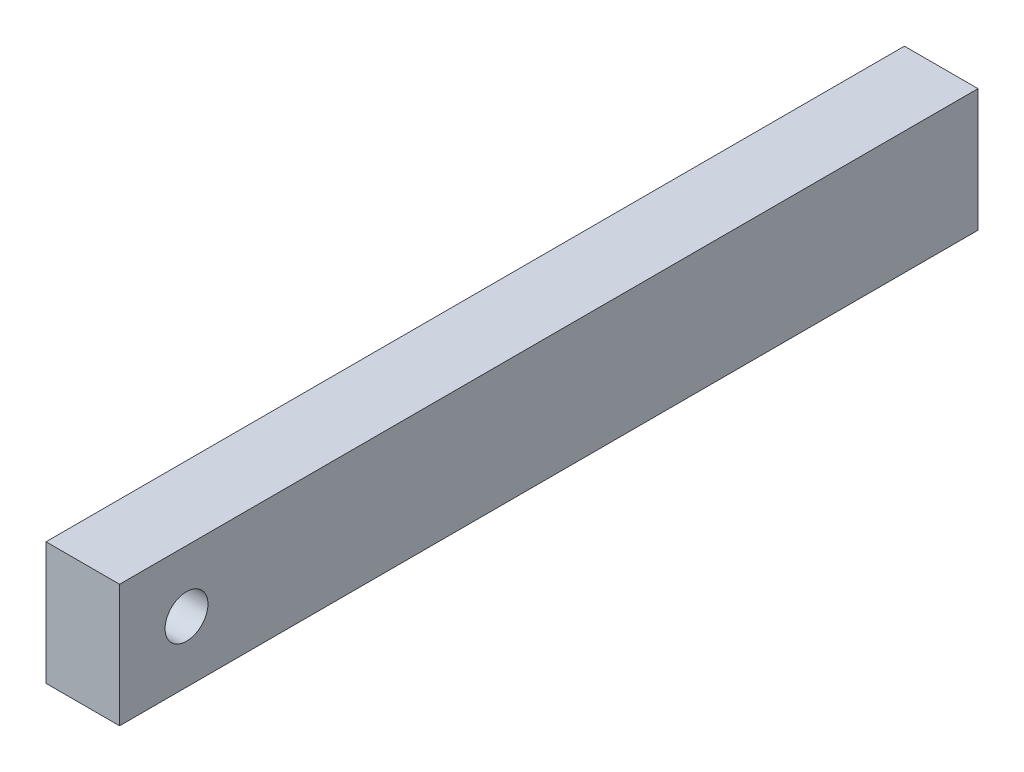
ISO-10303-21;
HEADER;
FILE_DESCRIPTION(('STEP AP214'),'2;1');
FILE_NAME('part.step','',(''),(''),'','','');
FILE_SCHEMA(('AUTOMOTIVE_DESIGN { 1 0 10303 214 1 1 1 1 }'));
ENDSEC;
DATA;
#1=APPLICATION_CONTEXT('core data for automotive mechanical design processes');
#2=APPLICATION_PROTOCOL_DEFINITION('international standard','automotive_design',2000,#1);
#3=PRODUCT_CONTEXT('',#1,'mechanical');
#4=PRODUCT('Part','Part','',(#3));
#5=PRODUCT_RELATED_PRODUCT_CATEGORY('part','',(#4));
#6=PRODUCT_DEFINITION_FORMATION('','',#4);
#7=PRODUCT_DEFINITION_CONTEXT('part definition',#1,'design');
#8=PRODUCT_DEFINITION('design','',#6,#7);
#9=PRODUCT_DEFINITION_SHAPE('','',#8);
#10=(LENGTH_UNIT() NAMED_UNIT(*) SI_UNIT(.MILLI.,.METRE.));
#11=(NAMED_UNIT(*) PLANE_ANGLE_UNIT() SI_UNIT($,.RADIAN.));
#12=(NAMED_UNIT(*) SI_UNIT($,.STERADIAN.) SOLID_ANGLE_UNIT());
#13=UNCERTAINTY_MEASURE_WITH_UNIT(LENGTH_MEASURE(1.E-05),#10,'distance_accuracy_value','');
#14=(GEOMETRIC_REPRESENTATION_CONTEXT(3) GLOBAL_UNCERTAINTY_ASSIGNED_CONTEXT((#13)) GLOBAL_UNIT_ASSIGNED_CONTEXT((#10,
#11,#12)) REPRESENTATION_CONTEXT('',''));
#15=CARTESIAN_POINT('',(0.,0.,0.));
#16=DIRECTION('',(0.,0.,1.));
#17=DIRECTION('',(1.,0.,0.));
#18=AXIS2_PLACEMENT_3D('',#15,#16,#17);
#19=CARTESIAN_POINT('',(-3.,-5.,70.));
#20=DIRECTION('',(1.,0.,0.));
#21=DIRECTION('',(0.,0.,-1.));
#22=AXIS2_PLACEMENT_3D('',#19,#20,#21);
#23=PLANE('',#22);
#24=CARTESIAN_POINT('',(-3.,0.,64.5424429410115));
#25=DIRECTION('',(1.,0.,0.));
#26=DIRECTION('',(0.,0.,-1.));
#27=AXIS2_PLACEMENT_3D('',#24,#25,#26);
#28=CIRCLE('',#27,1.75);
#29=CARTESIAN_POINT('',(-3.,0.,62.7924429410115));
#30=VERTEX_POINT('',#29);
#31=EDGE_CURVE('E111',#30,#30,#28,.T.);
#32=ORIENTED_EDGE('',*,*,#31,.T.);
#33=EDGE_LOOP('',(#32));
#34=FACE_BOUND('',#33,.T.);
#35=DIRECTION('',(0.,-1.,0.));
#36=VECTOR('',#35,1.);
#37=CARTESIAN_POINT('',(-3.,-5.,0.));
#38=LINE('',#37,#36);
#39=CARTESIAN_POINT('',(-3.,5.,0.));
#40=VERTEX_POINT('',#39);
#41=CARTESIAN_POINT('',(-3.,-5.,0.));
#42=VERTEX_POINT('',#41);
#43=EDGE_CURVE('E107',#40,#42,#38,.T.);
#44=ORIENTED_EDGE('',*,*,#43,.T.);
#45=DIRECTION('',(0.,0.,-1.));
#46=VECTOR('',#45,1.);
#47=CARTESIAN_POINT('',(-3.,-5.,70.));
#48=LINE('',#47,#46);
#49=CARTESIAN_POINT('',(-3.,-5.,70.));
#50=VERTEX_POINT('',#49);
#51=EDGE_CURVE('E11',#50,#42,#48,.T.);
#52=ORIENTED_EDGE('',*,*,#51,.F.);
#53=DIRECTION('',(0.,-1.,0.));
#54=VECTOR('',#53,1.);
#55=CARTESIAN_POINT('',(-3.,-5.,70.));
#56=LINE('',#55,#54);
#57=CARTESIAN_POINT('',(-3.,5.,70.));
#58=VERTEX_POINT('',#57);
#59=EDGE_CURVE('E91',#58,#50,#56,.T.);
#60=ORIENTED_EDGE('',*,*,#59,.F.);
#61=DIRECTION('',(0.,0.,-1.));
#62=VECTOR('',#61,1.);
#63=CARTESIAN_POINT('',(-3.,5.,70.));
#64=LINE('',#63,#62);
#65=EDGE_CURVE('E103',#58,#40,#64,.T.);
#66=ORIENTED_EDGE('',*,*,#65,.T.);
#67=EDGE_LOOP('',(#44,#52,#60,#66));
#68=FACE_BOUND('',#67,.T.);
#69=ADVANCED_FACE('F39',(#34,#68),#23,.F.);
#70=CARTESIAN_POINT('',(3.,-5.,70.));
#71=DIRECTION('',(0.,1.,0.));
#72=DIRECTION('',(-1.,0.,0.));
#73=AXIS2_PLACEMENT_3D('',#70,#71,#72);
#74=PLANE('',#73);
#75=DIRECTION('',(1.,0.,0.));
#76=VECTOR('',#75,1.);
#77=CARTESIAN_POINT('',(3.,-5.,0.));
#78=LINE('',#77,#76);
#79=CARTESIAN_POINT('',(3.,-5.,0.));
#80=VERTEX_POINT('',#79);
#81=EDGE_CURVE('E96',#42,#80,#78,.T.);
#82=ORIENTED_EDGE('',*,*,#81,.T.);
#83=DIRECTION('',(0.,0.,-1.));
#84=VECTOR('',#83,1.);
#85=CARTESIAN_POINT('',(3.,-5.,70.));
#86=LINE('',#85,#84);
#87=CARTESIAN_POINT('',(3.,-5.,70.));
#88=VERTEX_POINT('',#87);
#89=EDGE_CURVE('E48',#88,#80,#86,.T.);
#90=ORIENTED_EDGE('',*,*,#89,.F.);
#91=DIRECTION('',(1.,0.,0.));
#92=VECTOR('',#91,1.);
#93=CARTESIAN_POINT('',(3.,-5.,70.));
#94=LINE('',#93,#92);
#95=EDGE_CURVE('E86',#50,#88,#94,.T.);
#96=ORIENTED_EDGE('',*,*,#95,.F.);
#97=ORIENTED_EDGE('',*,*,#51,.T.);
#98=EDGE_LOOP('',(#82,#90,#96,#97));
#99=FACE_BOUND('',#98,.T.);
#100=ADVANCED_FACE('F95',(#99),#74,.F.);
#101=CARTESIAN_POINT('',(3.,-5.,70.));
#102=DIRECTION('',(-1.,0.,0.));
#103=DIRECTION('',(0.,0.,1.));
#104=AXIS2_PLACEMENT_3D('',#101,#102,#103);
#105=PLANE('',#104);
#106=CARTESIAN_POINT('',(3.,0.,64.5424429410115));
#107=DIRECTION('',(1.,0.,0.));
#108=DIRECTION('',(0.,0.,-1.));
#109=AXIS2_PLACEMENT_3D('',#106,#107,#108);
#110=CIRCLE('',#109,1.75);
#111=CARTESIAN_POINT('',(3.,0.,62.7924429410115));
#112=VERTEX_POINT('',#111);
#113=EDGE_CURVE('E128',#112,#112,#110,.T.);
#114=ORIENTED_EDGE('',*,*,#113,.F.);
#115=EDGE_LOOP('',(#114));
#116=FACE_BOUND('',#115,.T.);
#117=DIRECTION('',(0.,1.,0.));
#118=VECTOR('',#117,1.);
#119=CARTESIAN_POINT('',(3.,-5.,0.));
#120=LINE('',#119,#118);
#121=CARTESIAN_POINT('',(3.,5.,0.));
#122=VERTEX_POINT('',#121);
#123=EDGE_CURVE('E73',#80,#122,#120,.T.);
#124=ORIENTED_EDGE('',*,*,#123,.T.);
#125=DIRECTION('',(0.,0.,-1.));
#126=VECTOR('',#125,1.);
#127=CARTESIAN_POINT('',(3.,5.,70.));
#128=LINE('',#127,#126);
#129=CARTESIAN_POINT('',(3.,5.,70.));
#130=VERTEX_POINT('',#129);
#131=EDGE_CURVE('E98',#130,#122,#128,.T.);
#132=ORIENTED_EDGE('',*,*,#131,.F.);
#133=DIRECTION('',(0.,1.,0.));
#134=VECTOR('',#133,1.);
#135=CARTESIAN_POINT('',(3.,-5.,70.));
#136=LINE('',#135,#134);
#137=EDGE_CURVE('E89',#88,#130,#136,.T.);
#138=ORIENTED_EDGE('',*,*,#137,.F.);
#139=ORIENTED_EDGE('',*,*,#89,.T.);
#140=EDGE_LOOP('',(#124,#132,#138,#139));
#141=FACE_BOUND('',#140,.T.);
#142=ADVANCED_FACE('F99',(#116,#141),#105,.F.);
#143=CARTESIAN_POINT('',(3.,5.,70.));
#144=DIRECTION('',(0.,-1.,0.));
#145=DIRECTION('',(0.,0.,-1.));
#146=AXIS2_PLACEMENT_3D('',#143,#144,#145);
#147=PLANE('',#146);
#148=DIRECTION('',(-1.,0.,0.));
#149=VECTOR('',#148,1.);
#150=CARTESIAN_POINT('',(3.,5.,0.));
#151=LINE('',#150,#149);
#152=EDGE_CURVE('E79',#122,#40,#151,.T.);
#153=ORIENTED_EDGE('',*,*,#152,.T.);
#154=ORIENTED_EDGE('',*,*,#65,.F.);
#155=DIRECTION('',(-1.,0.,0.));
#156=VECTOR('',#155,1.);
#157=CARTESIAN_POINT('',(3.,5.,70.));
#158=LINE('',#157,#156);
#159=EDGE_CURVE('E56',#130,#58,#158,.T.);
#160=ORIENTED_EDGE('',*,*,#159,.F.);
#161=ORIENTED_EDGE('',*,*,#131,.T.);
#162=EDGE_LOOP('',(#153,#154,#160,#161));
#163=FACE_BOUND('',#162,.T.);
#164=ADVANCED_FACE('F121',(#163),#147,.F.);
#165=CARTESIAN_POINT('',(0.,0.,70.));
#166=DIRECTION('',(0.,0.,1.));
#167=DIRECTION('',(1.,0.,0.));
#168=AXIS2_PLACEMENT_3D('',#165,#166,#167);
#169=PLANE('',#168);
#170=ORIENTED_EDGE('',*,*,#59,.T.);
#171=ORIENTED_EDGE('',*,*,#95,.T.);
#172=ORIENTED_EDGE('',*,*,#137,.T.);
#173=ORIENTED_EDGE('',*,*,#159,.T.);
#174=EDGE_LOOP('',(#170,#171,#172,#173));
#175=FACE_BOUND('',#174,.T.);
#176=ADVANCED_FACE('F87',(#175),#169,.T.);
#177=CARTESIAN_POINT('',(0.,0.,0.));
#178=DIRECTION('',(0.,0.,1.));
#179=DIRECTION('',(1.,0.,0.));
#180=AXIS2_PLACEMENT_3D('',#177,#178,#179);
#181=PLANE('',#180);
#182=ORIENTED_EDGE('',*,*,#43,.F.);
#183=ORIENTED_EDGE('',*,*,#152,.F.);
#184=ORIENTED_EDGE('',*,*,#123,.F.);
#185=ORIENTED_EDGE('',*,*,#81,.F.);
#186=EDGE_LOOP('',(#182,#183,#184,#185));
#187=FACE_BOUND('',#186,.T.);
#188=ADVANCED_FACE('F124',(#187),#181,.F.);
#189=CARTESIAN_POINT('',(-3.,0.,64.5424429410115));
#190=DIRECTION('',(1.,0.,0.));
#191=DIRECTION('',(0.,0.,-1.));
#192=AXIS2_PLACEMENT_3D('',#189,#190,#191);
#193=CYLINDRICAL_SURFACE('',#192,1.75);
#194=ORIENTED_EDGE('',*,*,#31,.F.);
#195=EDGE_LOOP('',(#194));
#196=FACE_BOUND('',#195,.T.);
#197=ORIENTED_EDGE('',*,*,#113,.T.);
#198=EDGE_LOOP('',(#197));
#199=FACE_BOUND('',#198,.T.);
#200=ADVANCED_FACE('F137',(#196,#199),#193,.F.);
#201=CLOSED_SHELL('',(#69,#100,#142,#164,#176,#188,#200));
#202=MANIFOLD_SOLID_BREP('B2',#201);
#203=ADVANCED_BREP_SHAPE_REPRESENTATION('',(#18,#202),#14);
#204=SHAPE_DEFINITION_REPRESENTATION(#9,#203);
ENDSEC;
END-ISO-10303-21;
